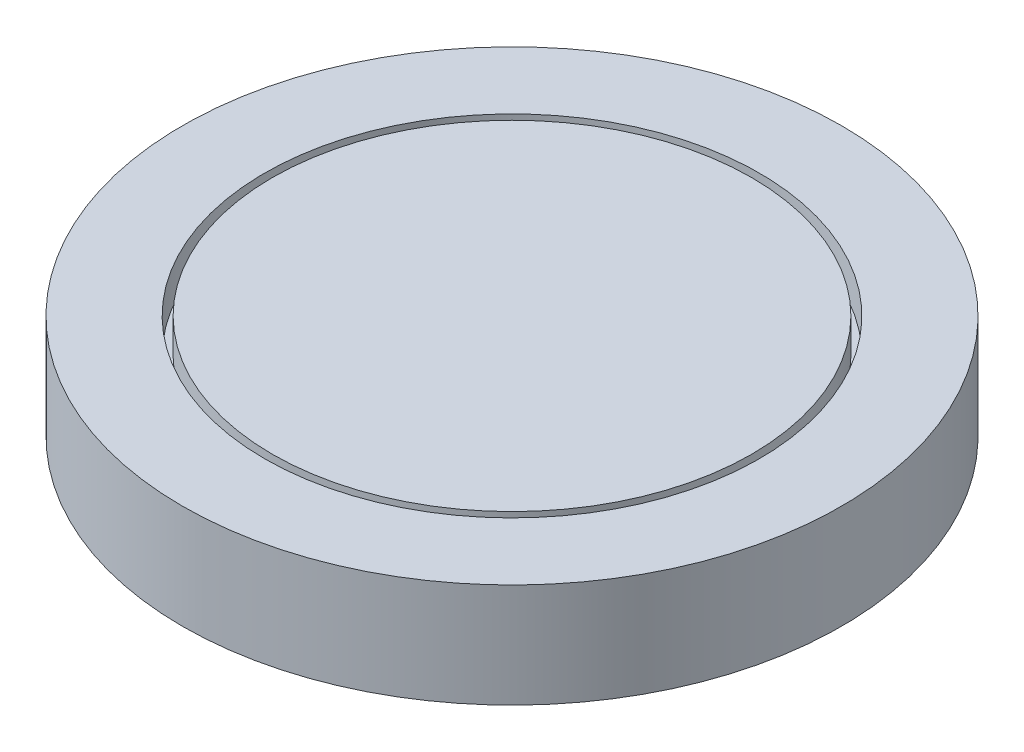
ISO-10303-21;
HEADER;
FILE_DESCRIPTION(('STEP AP214'),'2;1');
FILE_NAME('part.step','',(''),(''),'','','');
FILE_SCHEMA(('AUTOMOTIVE_DESIGN { 1 0 10303 214 1 1 1 1 }'));
ENDSEC;
DATA;
#1=APPLICATION_CONTEXT('core data for automotive mechanical design processes');
#2=APPLICATION_PROTOCOL_DEFINITION('international standard','automotive_design',2000,#1);
#3=PRODUCT_CONTEXT('',#1,'mechanical');
#4=PRODUCT('Part','Part','',(#3));
#5=PRODUCT_RELATED_PRODUCT_CATEGORY('part','',(#4));
#6=PRODUCT_DEFINITION_FORMATION('','',#4);
#7=PRODUCT_DEFINITION_CONTEXT('part definition',#1,'design');
#8=PRODUCT_DEFINITION('design','',#6,#7);
#9=PRODUCT_DEFINITION_SHAPE('','',#8);
#10=(LENGTH_UNIT() NAMED_UNIT(*) SI_UNIT(.MILLI.,.METRE.));
#11=(NAMED_UNIT(*) PLANE_ANGLE_UNIT() SI_UNIT($,.RADIAN.));
#12=(NAMED_UNIT(*) SI_UNIT($,.STERADIAN.) SOLID_ANGLE_UNIT());
#13=UNCERTAINTY_MEASURE_WITH_UNIT(LENGTH_MEASURE(1.E-05),#10,'distance_accuracy_value','');
#14=(GEOMETRIC_REPRESENTATION_CONTEXT(3) GLOBAL_UNCERTAINTY_ASSIGNED_CONTEXT((#13)) GLOBAL_UNIT_ASSIGNED_CONTEXT((#10,
#11,#12)) REPRESENTATION_CONTEXT('',''));
#15=CARTESIAN_POINT('',(0.,0.,0.));
#16=DIRECTION('',(0.,0.,1.));
#17=DIRECTION('',(1.,0.,0.));
#18=AXIS2_PLACEMENT_3D('',#15,#16,#17);
#19=CARTESIAN_POINT('',(0.,3.,0.));
#20=DIRECTION('',(0.,-1.,0.));
#21=DIRECTION('',(0.,0.,-1.));
#22=AXIS2_PLACEMENT_3D('',#19,#20,#21);
#23=CYLINDRICAL_SURFACE('',#22,9.5);
#24=CARTESIAN_POINT('',(0.,3.,0.));
#25=DIRECTION('',(0.,1.,0.));
#26=DIRECTION('',(0.,0.,1.));
#27=AXIS2_PLACEMENT_3D('',#24,#25,#26);
#28=CIRCLE('',#27,9.5);
#29=CARTESIAN_POINT('',(0.,3.,9.5));
#30=VERTEX_POINT('',#29);
#31=EDGE_CURVE('E10',#30,#30,#28,.T.);
#32=ORIENTED_EDGE('',*,*,#31,.F.);
#33=EDGE_LOOP('',(#32));
#34=FACE_BOUND('',#33,.T.);
#35=CARTESIAN_POINT('',(0.,0.,0.));
#36=DIRECTION('',(0.,1.,0.));
#37=DIRECTION('',(0.,0.,1.));
#38=AXIS2_PLACEMENT_3D('',#35,#36,#37);
#39=CIRCLE('',#38,9.5);
#40=CARTESIAN_POINT('',(0.,0.,9.5));
#41=VERTEX_POINT('',#40);
#42=EDGE_CURVE('E35',#41,#41,#39,.T.);
#43=ORIENTED_EDGE('',*,*,#42,.T.);
#44=EDGE_LOOP('',(#43));
#45=FACE_BOUND('',#44,.T.);
#46=ADVANCED_FACE('F32',(#34,#45),#23,.T.);
#47=CARTESIAN_POINT('',(0.,3.,0.));
#48=DIRECTION('',(0.,1.,0.));
#49=DIRECTION('',(0.,0.,1.));
#50=AXIS2_PLACEMENT_3D('',#47,#48,#49);
#51=PLANE('',#50);
#52=CARTESIAN_POINT('',(0.,3.,0.));
#53=DIRECTION('',(0.,1.,0.));
#54=DIRECTION('',(0.,0.,1.));
#55=AXIS2_PLACEMENT_3D('',#52,#53,#54);
#56=CIRCLE('',#55,7.13206418000378);
#57=CARTESIAN_POINT('',(0.,3.,7.13206418000378));
#58=VERTEX_POINT('',#57);
#59=EDGE_CURVE('E44',#58,#58,#56,.T.);
#60=ORIENTED_EDGE('',*,*,#59,.F.);
#61=EDGE_LOOP('',(#60));
#62=FACE_BOUND('',#61,.T.);
#63=ORIENTED_EDGE('',*,*,#31,.T.);
#64=EDGE_LOOP('',(#63));
#65=FACE_BOUND('',#64,.T.);
#66=ADVANCED_FACE('F77',(#62,#65),#51,.T.);
#67=CARTESIAN_POINT('',(0.,0.,0.));
#68=DIRECTION('',(0.,1.,0.));
#69=DIRECTION('',(0.,0.,1.));
#70=AXIS2_PLACEMENT_3D('',#67,#68,#69);
#71=PLANE('',#70);
#72=ORIENTED_EDGE('',*,*,#42,.F.);
#73=EDGE_LOOP('',(#72));
#74=FACE_BOUND('',#73,.T.);
#75=ADVANCED_FACE('F73',(#74),#71,.F.);
#76=CARTESIAN_POINT('',(0.,2.,0.));
#77=DIRECTION('',(0.,1.,0.));
#78=DIRECTION('',(0.,0.,1.));
#79=AXIS2_PLACEMENT_3D('',#76,#77,#78);
#80=CYLINDRICAL_SURFACE('',#79,7.13206418000378);
#81=CARTESIAN_POINT('',(0.,2.,0.));
#82=DIRECTION('',(0.,1.,0.));
#83=DIRECTION('',(0.,0.,1.));
#84=AXIS2_PLACEMENT_3D('',#81,#82,#83);
#85=CIRCLE('',#84,7.13206418000378);
#86=CARTESIAN_POINT('',(0.,2.,7.13206418000378));
#87=VERTEX_POINT('',#86);
#88=EDGE_CURVE('E42',#87,#87,#85,.T.);
#89=ORIENTED_EDGE('',*,*,#88,.F.);
#90=EDGE_LOOP('',(#89));
#91=FACE_BOUND('',#90,.T.);
#92=ORIENTED_EDGE('',*,*,#59,.T.);
#93=EDGE_LOOP('',(#92));
#94=FACE_BOUND('',#93,.T.);
#95=ADVANCED_FACE('F67',(#91,#94),#80,.F.);
#96=CARTESIAN_POINT('',(0.,2.,0.));
#97=DIRECTION('',(0.,1.,0.));
#98=DIRECTION('',(0.,0.,1.));
#99=AXIS2_PLACEMENT_3D('',#96,#97,#98);
#100=PLANE('',#99);
#101=CARTESIAN_POINT('',(0.,2.,0.));
#102=DIRECTION('',(0.,1.,0.));
#103=DIRECTION('',(0.,0.,1.));
#104=AXIS2_PLACEMENT_3D('',#101,#102,#103);
#105=CIRCLE('',#104,6.90818458416036);
#106=CARTESIAN_POINT('',(0.,2.,6.90818458416036));
#107=VERTEX_POINT('',#106);
#108=EDGE_CURVE('E50',#107,#107,#105,.T.);
#109=ORIENTED_EDGE('',*,*,#108,.F.);
#110=EDGE_LOOP('',(#109));
#111=FACE_BOUND('',#110,.T.);
#112=ORIENTED_EDGE('',*,*,#88,.T.);
#113=EDGE_LOOP('',(#112));
#114=FACE_BOUND('',#113,.T.);
#115=ADVANCED_FACE('F61',(#111,#114),#100,.T.);
#116=CARTESIAN_POINT('',(0.,3.,0.));
#117=DIRECTION('',(0.,-1.,0.));
#118=DIRECTION('',(0.,0.,-1.));
#119=AXIS2_PLACEMENT_3D('',#116,#117,#118);
#120=CYLINDRICAL_SURFACE('',#119,6.90818458416036);
#121=CARTESIAN_POINT('',(0.,3.,0.));
#122=DIRECTION('',(0.,1.,0.));
#123=DIRECTION('',(0.,0.,1.));
#124=AXIS2_PLACEMENT_3D('',#121,#122,#123);
#125=CIRCLE('',#124,6.90818458416036);
#126=CARTESIAN_POINT('',(0.,3.,6.90818458416036));
#127=VERTEX_POINT('',#126);
#128=EDGE_CURVE('E47',#127,#127,#125,.T.);
#129=ORIENTED_EDGE('',*,*,#128,.F.);
#130=EDGE_LOOP('',(#129));
#131=FACE_BOUND('',#130,.T.);
#132=ORIENTED_EDGE('',*,*,#108,.T.);
#133=EDGE_LOOP('',(#132));
#134=FACE_BOUND('',#133,.T.);
#135=ADVANCED_FACE('F58',(#131,#134),#120,.T.);
#136=CARTESIAN_POINT('',(0.,3.,0.));
#137=DIRECTION('',(0.,1.,0.));
#138=DIRECTION('',(0.,0.,1.));
#139=AXIS2_PLACEMENT_3D('',#136,#137,#138);
#140=PLANE('',#139);
#141=ORIENTED_EDGE('',*,*,#128,.T.);
#142=EDGE_LOOP('',(#141));
#143=FACE_BOUND('',#142,.T.);
#144=ADVANCED_FACE('F56',(#143),#140,.T.);
#145=CLOSED_SHELL('',(#46,#66,#75,#95,#115,#135,#144));
#146=MANIFOLD_SOLID_BREP('B2',#145);
#147=ADVANCED_BREP_SHAPE_REPRESENTATION('',(#18,#146),#14);
#148=SHAPE_DEFINITION_REPRESENTATION(#9,#147);
ENDSEC;
END-ISO-10303-21;
